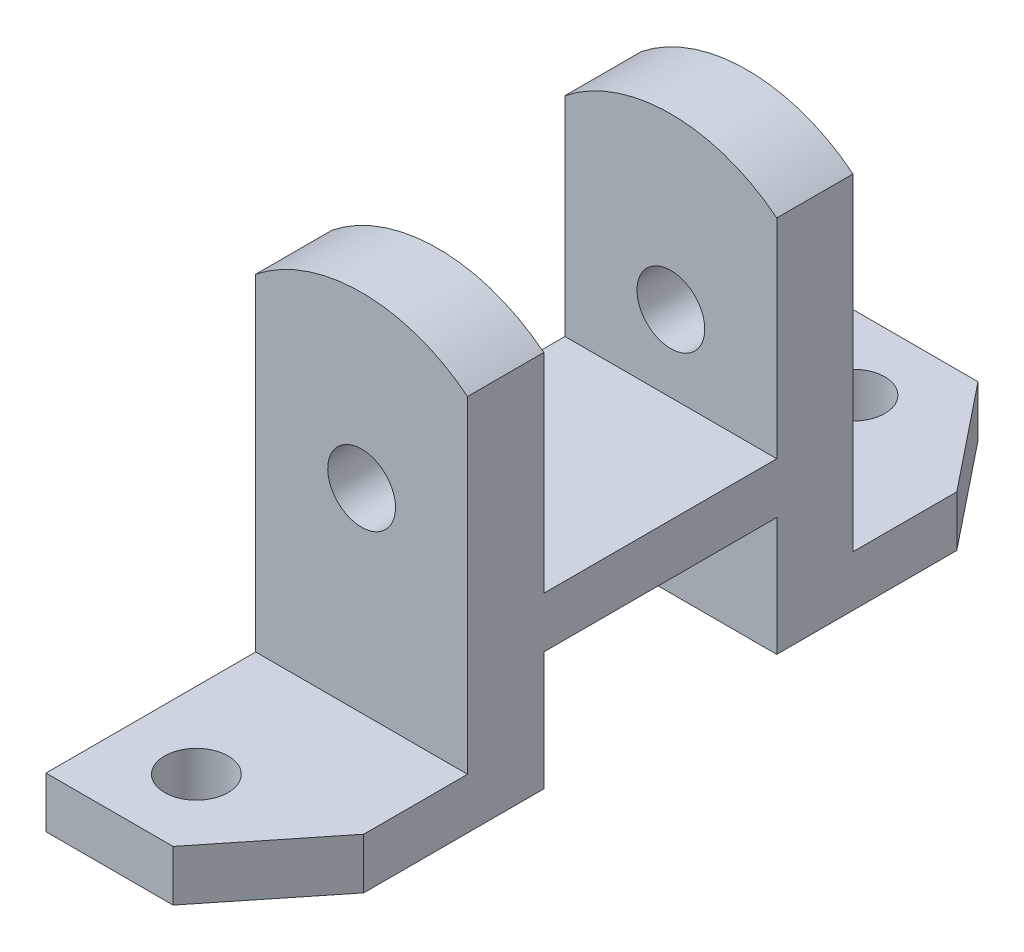
ISO-10303-21;
HEADER;
FILE_DESCRIPTION(('STEP AP214'),'2;1');
FILE_NAME('part.step','',(''),(''),'','','');
FILE_SCHEMA(('AUTOMOTIVE_DESIGN { 1 0 10303 214 1 1 1 1 }'));
ENDSEC;
DATA;
#1=APPLICATION_CONTEXT('core data for automotive mechanical design processes');
#2=APPLICATION_PROTOCOL_DEFINITION('international standard','automotive_design',2000,#1);
#3=PRODUCT_CONTEXT('',#1,'mechanical');
#4=PRODUCT('Part','Part','',(#3));
#5=PRODUCT_RELATED_PRODUCT_CATEGORY('part','',(#4));
#6=PRODUCT_DEFINITION_FORMATION('','',#4);
#7=PRODUCT_DEFINITION_CONTEXT('part definition',#1,'design');
#8=PRODUCT_DEFINITION('design','',#6,#7);
#9=PRODUCT_DEFINITION_SHAPE('','',#8);
#10=(LENGTH_UNIT() NAMED_UNIT(*) SI_UNIT(.MILLI.,.METRE.));
#11=(NAMED_UNIT(*) PLANE_ANGLE_UNIT() SI_UNIT($,.RADIAN.));
#12=(NAMED_UNIT(*) SI_UNIT($,.STERADIAN.) SOLID_ANGLE_UNIT());
#13=UNCERTAINTY_MEASURE_WITH_UNIT(LENGTH_MEASURE(1.E-05),#10,'distance_accuracy_value','');
#14=(GEOMETRIC_REPRESENTATION_CONTEXT(3) GLOBAL_UNCERTAINTY_ASSIGNED_CONTEXT((#13)) GLOBAL_UNIT_ASSIGNED_CONTEXT((#10,
#11,#12)) REPRESENTATION_CONTEXT('',''));
#15=CARTESIAN_POINT('',(0.,0.,0.));
#16=DIRECTION('',(0.,0.,1.));
#17=DIRECTION('',(1.,0.,0.));
#18=AXIS2_PLACEMENT_3D('',#15,#16,#17);
#19=CARTESIAN_POINT('',(25.,-40.,27.5));
#20=DIRECTION('',(0.,0.,1.));
#21=DIRECTION('',(1.,0.,0.));
#22=AXIS2_PLACEMENT_3D('',#19,#20,#21);
#23=PLANE('',#22);
#24=DIRECTION('',(-1.,0.,0.));
#25=VECTOR('',#24,1.);
#26=CARTESIAN_POINT('',(25.,-12.,27.5));
#27=LINE('',#26,#25);
#28=CARTESIAN_POINT('',(-11.,-12.,27.5));
#29=VERTEX_POINT('',#28);
#30=CARTESIAN_POINT('',(-25.,-12.,27.5));
#31=VERTEX_POINT('',#30);
#32=EDGE_CURVE('E249',#29,#31,#27,.T.);
#33=ORIENTED_EDGE('',*,*,#32,.F.);
#34=DIRECTION('',(0.,-1.,0.));
#35=VECTOR('',#34,1.);
#36=CARTESIAN_POINT('',(-11.,43.578772926361,27.5));
#37=LINE('',#36,#35);
#38=CARTESIAN_POINT('',(-11.,-40.,27.5));
#39=VERTEX_POINT('',#38);
#40=EDGE_CURVE('E233',#29,#39,#37,.T.);
#41=ORIENTED_EDGE('',*,*,#40,.T.);
#42=DIRECTION('',(-1.,0.,0.));
#43=VECTOR('',#42,1.);
#44=CARTESIAN_POINT('',(25.,-40.,27.5));
#45=LINE('',#44,#43);
#46=CARTESIAN_POINT('',(-25.,-40.,27.5));
#47=VERTEX_POINT('',#46);
#48=EDGE_CURVE('E265',#39,#47,#45,.T.);
#49=ORIENTED_EDGE('',*,*,#48,.T.);
#50=DIRECTION('',(0.,1.,0.));
#51=VECTOR('',#50,1.);
#52=CARTESIAN_POINT('',(-25.,-40.,27.5));
#53=LINE('',#52,#51);
#54=EDGE_CURVE('E256',#47,#31,#53,.T.);
#55=ORIENTED_EDGE('',*,*,#54,.T.);
#56=EDGE_LOOP('',(#33,#41,#49,#55));
#57=FACE_BOUND('',#56,.T.);
#58=ADVANCED_FACE('F83',(#57),#23,.F.);
#59=CARTESIAN_POINT('',(25.,-12.,27.5));
#60=DIRECTION('',(0.,1.,0.));
#61=DIRECTION('',(0.,0.,1.));
#62=AXIS2_PLACEMENT_3D('',#59,#60,#61);
#63=PLANE('',#62);
#64=DIRECTION('',(-1.,0.,0.));
#65=VECTOR('',#64,1.);
#66=CARTESIAN_POINT('',(25.,-12.,-27.5));
#67=LINE('',#66,#65);
#68=CARTESIAN_POINT('',(-11.,-12.,-27.5));
#69=VERTEX_POINT('',#68);
#70=CARTESIAN_POINT('',(-25.,-12.,-27.5));
#71=VERTEX_POINT('',#70);
#72=EDGE_CURVE('E251',#69,#71,#67,.T.);
#73=ORIENTED_EDGE('',*,*,#72,.F.);
#74=DIRECTION('',(0.,0.,-1.));
#75=VECTOR('',#74,1.);
#76=CARTESIAN_POINT('',(-11.,-12.,-27.5));
#77=LINE('',#76,#75);
#78=EDGE_CURVE('E236',#29,#69,#77,.T.);
#79=ORIENTED_EDGE('',*,*,#78,.F.);
#80=ORIENTED_EDGE('',*,*,#32,.T.);
#81=DIRECTION('',(0.,0.,-1.));
#82=VECTOR('',#81,1.);
#83=CARTESIAN_POINT('',(-25.,-12.,27.5));
#84=LINE('',#83,#82);
#85=EDGE_CURVE('E444',#31,#71,#84,.T.);
#86=ORIENTED_EDGE('',*,*,#85,.T.);
#87=EDGE_LOOP('',(#73,#79,#80,#86));
#88=FACE_BOUND('',#87,.T.);
#89=ADVANCED_FACE('F247',(#88),#63,.F.);
#90=CARTESIAN_POINT('',(25.,-12.,-27.5));
#91=DIRECTION('',(0.,0.,-1.));
#92=DIRECTION('',(0.,1.,0.));
#93=AXIS2_PLACEMENT_3D('',#90,#91,#92);
#94=PLANE('',#93);
#95=DIRECTION('',(-1.,0.,0.));
#96=VECTOR('',#95,1.);
#97=CARTESIAN_POINT('',(25.,-40.,-27.5));
#98=LINE('',#97,#96);
#99=CARTESIAN_POINT('',(-11.,-40.,-27.5));
#100=VERTEX_POINT('',#99);
#101=CARTESIAN_POINT('',(-25.,-40.,-27.5));
#102=VERTEX_POINT('',#101);
#103=EDGE_CURVE('E403',#100,#102,#98,.T.);
#104=ORIENTED_EDGE('',*,*,#103,.F.);
#105=DIRECTION('',(0.,-1.,0.));
#106=VECTOR('',#105,1.);
#107=CARTESIAN_POINT('',(-11.,43.578772926361,-27.5));
#108=LINE('',#107,#106);
#109=EDGE_CURVE('E253',#69,#100,#108,.T.);
#110=ORIENTED_EDGE('',*,*,#109,.F.);
#111=ORIENTED_EDGE('',*,*,#72,.T.);
#112=DIRECTION('',(0.,-1.,0.));
#113=VECTOR('',#112,1.);
#114=CARTESIAN_POINT('',(-25.,-12.,-27.5));
#115=LINE('',#114,#113);
#116=EDGE_CURVE('E368',#71,#102,#115,.T.);
#117=ORIENTED_EDGE('',*,*,#116,.T.);
#118=EDGE_LOOP('',(#104,#110,#111,#117));
#119=FACE_BOUND('',#118,.T.);
#120=ADVANCED_FACE('F465',(#119),#94,.F.);
#121=CARTESIAN_POINT('',(25.,-28.,-45.5));
#122=DIRECTION('',(0.,0.,1.));
#123=DIRECTION('',(1.,0.,0.));
#124=AXIS2_PLACEMENT_3D('',#121,#122,#123);
#125=PLANE('',#124);
#126=CARTESIAN_POINT('',(0.,18.,-45.5));
#127=DIRECTION('',(0.,0.,1.));
#128=DIRECTION('',(1.,0.,0.));
#129=AXIS2_PLACEMENT_3D('',#126,#127,#128);
#130=CIRCLE('',#129,8.);
#131=CARTESIAN_POINT('',(8.,18.,-45.5));
#132=VERTEX_POINT('',#131);
#133=EDGE_CURVE('E358',#132,#132,#130,.T.);
#134=ORIENTED_EDGE('',*,*,#133,.T.);
#135=EDGE_LOOP('',(#134));
#136=FACE_BOUND('',#135,.T.);
#137=DIRECTION('',(0.,1.,0.));
#138=VECTOR('',#137,1.);
#139=CARTESIAN_POINT('',(-25.,-28.,-45.5));
#140=LINE('',#139,#138);
#141=CARTESIAN_POINT('',(-25.,-28.,-45.5));
#142=VERTEX_POINT('',#141);
#143=CARTESIAN_POINT('',(-25.,49.224989991992,-45.5));
#144=VERTEX_POINT('',#143);
#145=EDGE_CURVE('E414',#142,#144,#140,.T.);
#146=ORIENTED_EDGE('',*,*,#145,.T.);
#147=CARTESIAN_POINT('',(0.,18.,-45.5));
#148=DIRECTION('',(0.,0.,1.));
#149=DIRECTION('',(1.,0.,0.));
#150=AXIS2_PLACEMENT_3D('',#147,#148,#149);
#151=CIRCLE('',#150,40.);
#152=CARTESIAN_POINT('',(25.,49.224989991992,-45.5));
#153=VERTEX_POINT('',#152);
#154=EDGE_CURVE('E335',#144,#153,#151,.F.);
#155=ORIENTED_EDGE('',*,*,#154,.T.);
#156=DIRECTION('',(0.,1.,0.));
#157=VECTOR('',#156,1.);
#158=CARTESIAN_POINT('',(25.,-28.,-45.5));
#159=LINE('',#158,#157);
#160=CARTESIAN_POINT('',(25.,-28.,-45.5));
#161=VERTEX_POINT('',#160);
#162=EDGE_CURVE('E371',#161,#153,#159,.T.);
#163=ORIENTED_EDGE('',*,*,#162,.F.);
#164=DIRECTION('',(-1.,0.,0.));
#165=VECTOR('',#164,1.);
#166=CARTESIAN_POINT('',(25.,-28.,-45.5));
#167=LINE('',#166,#165);
#168=EDGE_CURVE('E292',#161,#142,#167,.T.);
#169=ORIENTED_EDGE('',*,*,#168,.T.);
#170=EDGE_LOOP('',(#146,#155,#163,#169));
#171=FACE_BOUND('',#170,.T.);
#172=ADVANCED_FACE('F485',(#136,#171),#125,.F.);
#173=CARTESIAN_POINT('',(25.,58.,-27.5));
#174=DIRECTION('',(0.,0.,-1.));
#175=DIRECTION('',(0.,1.,0.));
#176=AXIS2_PLACEMENT_3D('',#173,#174,#175);
#177=PLANE('',#176);
#178=CARTESIAN_POINT('',(0.,18.,-27.5));
#179=DIRECTION('',(0.,0.,-1.));
#180=DIRECTION('',(0.,1.,0.));
#181=AXIS2_PLACEMENT_3D('',#178,#179,#180);
#182=CIRCLE('',#181,8.);
#183=CARTESIAN_POINT('',(0.,26.,-27.5));
#184=VERTEX_POINT('',#183);
#185=EDGE_CURVE('E341',#184,#184,#182,.T.);
#186=ORIENTED_EDGE('',*,*,#185,.T.);
#187=EDGE_LOOP('',(#186));
#188=FACE_BOUND('',#187,.T.);
#189=CARTESIAN_POINT('',(0.,18.,-27.5));
#190=DIRECTION('',(0.,0.,-1.));
#191=DIRECTION('',(0.,1.,0.));
#192=AXIS2_PLACEMENT_3D('',#189,#190,#191);
#193=CIRCLE('',#192,40.);
#194=CARTESIAN_POINT('',(25.,49.224989991992,-27.5));
#195=VERTEX_POINT('',#194);
#196=CARTESIAN_POINT('',(-25.,49.224989991992,-27.5));
#197=VERTEX_POINT('',#196);
#198=EDGE_CURVE('E344',#195,#197,#193,.F.);
#199=ORIENTED_EDGE('',*,*,#198,.T.);
#200=DIRECTION('',(0.,-1.,0.));
#201=VECTOR('',#200,1.);
#202=CARTESIAN_POINT('',(-25.,58.,-27.5));
#203=LINE('',#202,#201);
#204=CARTESIAN_POINT('',(-25.,0.,-27.5));
#205=VERTEX_POINT('',#204);
#206=EDGE_CURVE('E417',#197,#205,#203,.T.);
#207=ORIENTED_EDGE('',*,*,#206,.T.);
#208=DIRECTION('',(-1.,0.,0.));
#209=VECTOR('',#208,1.);
#210=CARTESIAN_POINT('',(25.,0.,-27.5));
#211=LINE('',#210,#209);
#212=CARTESIAN_POINT('',(25.,0.,-27.5));
#213=VERTEX_POINT('',#212);
#214=EDGE_CURVE('E288',#213,#205,#211,.T.);
#215=ORIENTED_EDGE('',*,*,#214,.F.);
#216=DIRECTION('',(0.,-1.,0.));
#217=VECTOR('',#216,1.);
#218=CARTESIAN_POINT('',(25.,58.,-27.5));
#219=LINE('',#218,#217);
#220=EDGE_CURVE('E374',#195,#213,#219,.T.);
#221=ORIENTED_EDGE('',*,*,#220,.F.);
#222=EDGE_LOOP('',(#199,#207,#215,#221));
#223=FACE_BOUND('',#222,.T.);
#224=ADVANCED_FACE('F491',(#188,#223),#177,.F.);
#225=CARTESIAN_POINT('',(25.,58.,27.5));
#226=DIRECTION('',(0.,0.,1.));
#227=DIRECTION('',(0.,-1.,0.));
#228=AXIS2_PLACEMENT_3D('',#225,#226,#227);
#229=PLANE('',#228);
#230=CARTESIAN_POINT('',(0.,18.,27.5));
#231=DIRECTION('',(0.,0.,1.));
#232=DIRECTION('',(0.,-1.,0.));
#233=AXIS2_PLACEMENT_3D('',#230,#231,#232);
#234=CIRCLE('',#233,8.);
#235=CARTESIAN_POINT('',(0.,10.,27.5));
#236=VERTEX_POINT('',#235);
#237=EDGE_CURVE('E334',#236,#236,#234,.T.);
#238=ORIENTED_EDGE('',*,*,#237,.T.);
#239=EDGE_LOOP('',(#238));
#240=FACE_BOUND('',#239,.T.);
#241=DIRECTION('',(0.,1.,0.));
#242=VECTOR('',#241,1.);
#243=CARTESIAN_POINT('',(-25.,58.,27.5));
#244=LINE('',#243,#242);
#245=CARTESIAN_POINT('',(-25.,0.,27.5));
#246=VERTEX_POINT('',#245);
#247=CARTESIAN_POINT('',(-25.,49.224989991992,27.5));
#248=VERTEX_POINT('',#247);
#249=EDGE_CURVE('E423',#246,#248,#244,.T.);
#250=ORIENTED_EDGE('',*,*,#249,.T.);
#251=CARTESIAN_POINT('',(0.,18.,27.5));
#252=DIRECTION('',(0.,0.,1.));
#253=DIRECTION('',(0.,-1.,0.));
#254=AXIS2_PLACEMENT_3D('',#251,#252,#253);
#255=CIRCLE('',#254,40.);
#256=CARTESIAN_POINT('',(25.,49.224989991992,27.5));
#257=VERTEX_POINT('',#256);
#258=EDGE_CURVE('E351',#248,#257,#255,.F.);
#259=ORIENTED_EDGE('',*,*,#258,.T.);
#260=DIRECTION('',(0.,1.,0.));
#261=VECTOR('',#260,1.);
#262=CARTESIAN_POINT('',(25.,58.,27.5));
#263=LINE('',#262,#261);
#264=CARTESIAN_POINT('',(25.,0.,27.5));
#265=VERTEX_POINT('',#264);
#266=EDGE_CURVE('E380',#265,#257,#263,.T.);
#267=ORIENTED_EDGE('',*,*,#266,.F.);
#268=DIRECTION('',(-1.,0.,0.));
#269=VECTOR('',#268,1.);
#270=CARTESIAN_POINT('',(25.,0.,27.5));
#271=LINE('',#270,#269);
#272=EDGE_CURVE('E284',#265,#246,#271,.T.);
#273=ORIENTED_EDGE('',*,*,#272,.T.);
#274=EDGE_LOOP('',(#250,#259,#267,#273));
#275=FACE_BOUND('',#274,.T.);
#276=ADVANCED_FACE('F503',(#240,#275),#229,.F.);
#277=CARTESIAN_POINT('',(25.,-28.,45.5));
#278=DIRECTION('',(0.,0.,-1.));
#279=DIRECTION('',(0.,1.,0.));
#280=AXIS2_PLACEMENT_3D('',#277,#278,#279);
#281=PLANE('',#280);
#282=CARTESIAN_POINT('',(0.,18.,45.5));
#283=DIRECTION('',(0.,0.,-1.));
#284=DIRECTION('',(0.,1.,0.));
#285=AXIS2_PLACEMENT_3D('',#282,#283,#284);
#286=CIRCLE('',#285,8.);
#287=CARTESIAN_POINT('',(0.,26.,45.5));
#288=VERTEX_POINT('',#287);
#289=EDGE_CURVE('E331',#288,#288,#286,.T.);
#290=ORIENTED_EDGE('',*,*,#289,.T.);
#291=EDGE_LOOP('',(#290));
#292=FACE_BOUND('',#291,.T.);
#293=CARTESIAN_POINT('',(0.,18.,45.5));
#294=DIRECTION('',(0.,0.,-1.));
#295=DIRECTION('',(0.,1.,0.));
#296=AXIS2_PLACEMENT_3D('',#293,#294,#295);
#297=CIRCLE('',#296,40.);
#298=CARTESIAN_POINT('',(25.,49.224989991992,45.5));
#299=VERTEX_POINT('',#298);
#300=CARTESIAN_POINT('',(-25.,49.224989991992,45.5));
#301=VERTEX_POINT('',#300);
#302=EDGE_CURVE('E108',#299,#301,#297,.F.);
#303=ORIENTED_EDGE('',*,*,#302,.T.);
#304=DIRECTION('',(0.,-1.,0.));
#305=VECTOR('',#304,1.);
#306=CARTESIAN_POINT('',(-25.,-28.,45.5));
#307=LINE('',#306,#305);
#308=CARTESIAN_POINT('',(-25.,-28.,45.5));
#309=VERTEX_POINT('',#308);
#310=EDGE_CURVE('E427',#301,#309,#307,.T.);
#311=ORIENTED_EDGE('',*,*,#310,.T.);
#312=DIRECTION('',(-1.,0.,0.));
#313=VECTOR('',#312,1.);
#314=CARTESIAN_POINT('',(25.,-28.,45.5));
#315=LINE('',#314,#313);
#316=CARTESIAN_POINT('',(25.,-28.,45.5));
#317=VERTEX_POINT('',#316);
#318=EDGE_CURVE('E280',#317,#309,#315,.T.);
#319=ORIENTED_EDGE('',*,*,#318,.F.);
#320=DIRECTION('',(0.,-1.,0.));
#321=VECTOR('',#320,1.);
#322=CARTESIAN_POINT('',(25.,-28.,45.5));
#323=LINE('',#322,#321);
#324=EDGE_CURVE('E384',#299,#317,#323,.T.);
#325=ORIENTED_EDGE('',*,*,#324,.F.);
#326=EDGE_LOOP('',(#303,#311,#319,#325));
#327=FACE_BOUND('',#326,.T.);
#328=ADVANCED_FACE('F563',(#292,#327),#281,.F.);
#329=CARTESIAN_POINT('',(25.,-40.,-95.));
#330=DIRECTION('',(0.,0.,1.));
#331=DIRECTION('',(1.,0.,0.));
#332=AXIS2_PLACEMENT_3D('',#329,#330,#331);
#333=PLANE('',#332);
#334=DIRECTION('',(-1.,0.,0.));
#335=VECTOR('',#334,1.);
#336=CARTESIAN_POINT('',(25.,-28.,-95.));
#337=LINE('',#336,#335);
#338=CARTESIAN_POINT('',(4.9999999999999,-28.,-95.));
#339=VERTEX_POINT('',#338);
#340=CARTESIAN_POINT('',(-25.,-28.,-95.));
#341=VERTEX_POINT('',#340);
#342=EDGE_CURVE('E296',#339,#341,#337,.T.);
#343=ORIENTED_EDGE('',*,*,#342,.F.);
#344=DIRECTION('',(0.,-1.,0.));
#345=VECTOR('',#344,1.);
#346=CARTESIAN_POINT('',(4.9999999999999,-40.,-95.));
#347=LINE('',#346,#345);
#348=CARTESIAN_POINT('',(4.9999999999999,-40.,-95.));
#349=VERTEX_POINT('',#348);
#350=EDGE_CURVE('E322',#339,#349,#347,.T.);
#351=ORIENTED_EDGE('',*,*,#350,.T.);
#352=DIRECTION('',(-1.,0.,0.));
#353=VECTOR('',#352,1.);
#354=CARTESIAN_POINT('',(25.,-40.,-95.));
#355=LINE('',#354,#353);
#356=CARTESIAN_POINT('',(-25.,-40.,-95.));
#357=VERTEX_POINT('',#356);
#358=EDGE_CURVE('E299',#349,#357,#355,.T.);
#359=ORIENTED_EDGE('',*,*,#358,.T.);
#360=DIRECTION('',(0.,1.,0.));
#361=VECTOR('',#360,1.);
#362=CARTESIAN_POINT('',(-25.,-40.,-95.));
#363=LINE('',#362,#361);
#364=EDGE_CURVE('E407',#357,#341,#363,.T.);
#365=ORIENTED_EDGE('',*,*,#364,.T.);
#366=EDGE_LOOP('',(#343,#351,#359,#365));
#367=FACE_BOUND('',#366,.T.);
#368=ADVANCED_FACE('F474',(#367),#333,.F.);
#369=CARTESIAN_POINT('',(25.,-28.,-95.));
#370=DIRECTION('',(0.,-1.,0.));
#371=DIRECTION('',(0.,0.,-1.));
#372=AXIS2_PLACEMENT_3D('',#369,#370,#371);
#373=PLANE('',#372);
#374=CARTESIAN_POINT('',(-7.,-28.,-77.5));
#375=DIRECTION('',(0.,1.,0.));
#376=DIRECTION('',(0.,0.,1.));
#377=AXIS2_PLACEMENT_3D('',#374,#375,#376);
#378=CIRCLE('',#377,7.5);
#379=CARTESIAN_POINT('',(-7.,-28.,-70.));
#380=VERTEX_POINT('',#379);
#381=EDGE_CURVE('E514',#380,#380,#378,.T.);
#382=ORIENTED_EDGE('',*,*,#381,.F.);
#383=EDGE_LOOP('',(#382));
#384=FACE_BOUND('',#383,.T.);
#385=DIRECTION('',(0.,0.,1.));
#386=VECTOR('',#385,1.);
#387=CARTESIAN_POINT('',(25.,-28.,-95.));
#388=LINE('',#387,#386);
#389=CARTESIAN_POINT('',(25.,-28.,-69.9999999999999));
#390=VERTEX_POINT('',#389);
#391=EDGE_CURVE('E367',#390,#161,#388,.T.);
#392=ORIENTED_EDGE('',*,*,#391,.F.);
#393=DIRECTION('',(-0.624695047554424,0.,-0.780868809443031));
#394=VECTOR('',#393,1.);
#395=CARTESIAN_POINT('',(25.,-28.,-69.9999999999999));
#396=LINE('',#395,#394);
#397=EDGE_CURVE('E319',#390,#339,#396,.T.);
#398=ORIENTED_EDGE('',*,*,#397,.T.);
#399=ORIENTED_EDGE('',*,*,#342,.T.);
#400=DIRECTION('',(0.,0.,1.));
#401=VECTOR('',#400,1.);
#402=CARTESIAN_POINT('',(-25.,-28.,-95.));
#403=LINE('',#402,#401);
#404=EDGE_CURVE('E411',#341,#142,#403,.T.);
#405=ORIENTED_EDGE('',*,*,#404,.T.);
#406=ORIENTED_EDGE('',*,*,#168,.F.);
#407=EDGE_LOOP('',(#392,#398,#399,#405,#406));
#408=FACE_BOUND('',#407,.T.);
#409=ADVANCED_FACE('F484',(#384,#408),#373,.F.);
#410=CARTESIAN_POINT('',(25.,0.,27.5));
#411=DIRECTION('',(0.,-1.,0.));
#412=DIRECTION('',(0.,0.,-1.));
#413=AXIS2_PLACEMENT_3D('',#410,#411,#412);
#414=PLANE('',#413);
#415=DIRECTION('',(0.,0.,1.));
#416=VECTOR('',#415,1.);
#417=CARTESIAN_POINT('',(-25.,0.,27.5));
#418=LINE('',#417,#416);
#419=EDGE_CURVE('E420',#205,#246,#418,.T.);
#420=ORIENTED_EDGE('',*,*,#419,.T.);
#421=ORIENTED_EDGE('',*,*,#272,.F.);
#422=DIRECTION('',(0.,0.,1.));
#423=VECTOR('',#422,1.);
#424=CARTESIAN_POINT('',(25.,0.,27.5));
#425=LINE('',#424,#423);
#426=EDGE_CURVE('E377',#213,#265,#425,.T.);
#427=ORIENTED_EDGE('',*,*,#426,.F.);
#428=ORIENTED_EDGE('',*,*,#214,.T.);
#429=EDGE_LOOP('',(#420,#421,#427,#428));
#430=FACE_BOUND('',#429,.T.);
#431=ADVANCED_FACE('F498',(#430),#414,.F.);
#432=CARTESIAN_POINT('',(25.,-28.,95.));
#433=DIRECTION('',(0.,-1.,0.));
#434=DIRECTION('',(0.,0.,-1.));
#435=AXIS2_PLACEMENT_3D('',#432,#433,#434);
#436=PLANE('',#435);
#437=CARTESIAN_POINT('',(-7.,-28.,77.5));
#438=DIRECTION('',(0.,1.,0.));
#439=DIRECTION('',(0.,0.,1.));
#440=AXIS2_PLACEMENT_3D('',#437,#438,#439);
#441=CIRCLE('',#440,7.5);
#442=CARTESIAN_POINT('',(-7.,-28.,85.));
#443=VERTEX_POINT('',#442);
#444=EDGE_CURVE('E519',#443,#443,#441,.T.);
#445=ORIENTED_EDGE('',*,*,#444,.F.);
#446=EDGE_LOOP('',(#445));
#447=FACE_BOUND('',#446,.T.);
#448=DIRECTION('',(-1.,0.,0.));
#449=VECTOR('',#448,1.);
#450=CARTESIAN_POINT('',(25.,-28.,95.));
#451=LINE('',#450,#449);
#452=CARTESIAN_POINT('',(4.99999999999996,-28.,95.));
#453=VERTEX_POINT('',#452);
#454=CARTESIAN_POINT('',(-25.,-28.,95.));
#455=VERTEX_POINT('',#454);
#456=EDGE_CURVE('E277',#453,#455,#451,.T.);
#457=ORIENTED_EDGE('',*,*,#456,.F.);
#458=DIRECTION('',(0.624695047554424,0.,-0.780868809443031));
#459=VECTOR('',#458,1.);
#460=CARTESIAN_POINT('',(25.,-28.,69.9999999999999));
#461=LINE('',#460,#459);
#462=CARTESIAN_POINT('',(25.,-28.,69.9999999999999));
#463=VERTEX_POINT('',#462);
#464=EDGE_CURVE('E316',#453,#463,#461,.T.);
#465=ORIENTED_EDGE('',*,*,#464,.T.);
#466=DIRECTION('',(0.,0.,1.));
#467=VECTOR('',#466,1.);
#468=CARTESIAN_POINT('',(25.,-28.,95.));
#469=LINE('',#468,#467);
#470=EDGE_CURVE('E387',#317,#463,#469,.T.);
#471=ORIENTED_EDGE('',*,*,#470,.F.);
#472=ORIENTED_EDGE('',*,*,#318,.T.);
#473=DIRECTION('',(0.,0.,1.));
#474=VECTOR('',#473,1.);
#475=CARTESIAN_POINT('',(-25.,-28.,95.));
#476=LINE('',#475,#474);
#477=EDGE_CURVE('E430',#309,#455,#476,.T.);
#478=ORIENTED_EDGE('',*,*,#477,.T.);
#479=EDGE_LOOP('',(#457,#465,#471,#472,#478));
#480=FACE_BOUND('',#479,.T.);
#481=ADVANCED_FACE('F560',(#447,#480),#436,.F.);
#482=CARTESIAN_POINT('',(25.,-40.,95.));
#483=DIRECTION('',(0.,0.,-1.));
#484=DIRECTION('',(-1.,0.,0.));
#485=AXIS2_PLACEMENT_3D('',#482,#483,#484);
#486=PLANE('',#485);
#487=DIRECTION('',(-1.,0.,0.));
#488=VECTOR('',#487,1.);
#489=CARTESIAN_POINT('',(25.,-40.,95.));
#490=LINE('',#489,#488);
#491=CARTESIAN_POINT('',(4.99999999999996,-40.,95.));
#492=VERTEX_POINT('',#491);
#493=CARTESIAN_POINT('',(-25.,-40.,95.));
#494=VERTEX_POINT('',#493);
#495=EDGE_CURVE('E274',#492,#494,#490,.T.);
#496=ORIENTED_EDGE('',*,*,#495,.F.);
#497=DIRECTION('',(0.,1.,0.));
#498=VECTOR('',#497,1.);
#499=CARTESIAN_POINT('',(4.99999999999996,-28.,95.));
#500=LINE('',#499,#498);
#501=EDGE_CURVE('E313',#492,#453,#500,.T.);
#502=ORIENTED_EDGE('',*,*,#501,.T.);
#503=ORIENTED_EDGE('',*,*,#456,.T.);
#504=DIRECTION('',(0.,-1.,0.));
#505=VECTOR('',#504,1.);
#506=CARTESIAN_POINT('',(-25.,-40.,95.));
#507=LINE('',#506,#505);
#508=EDGE_CURVE('E434',#455,#494,#507,.T.);
#509=ORIENTED_EDGE('',*,*,#508,.T.);
#510=EDGE_LOOP('',(#496,#502,#503,#509));
#511=FACE_BOUND('',#510,.T.);
#512=ADVANCED_FACE('F552',(#511),#486,.F.);
#513=CARTESIAN_POINT('',(25.,-40.,95.));
#514=DIRECTION('',(0.,1.,0.));
#515=DIRECTION('',(0.,0.,1.));
#516=AXIS2_PLACEMENT_3D('',#513,#514,#515);
#517=PLANE('',#516);
#518=CARTESIAN_POINT('',(-7.,-40.,77.5));
#519=DIRECTION('',(0.,1.,0.));
#520=DIRECTION('',(0.,0.,1.));
#521=AXIS2_PLACEMENT_3D('',#518,#519,#520);
#522=CIRCLE('',#521,7.5);
#523=CARTESIAN_POINT('',(-7.,-40.,85.));
#524=VERTEX_POINT('',#523);
#525=EDGE_CURVE('E507',#524,#524,#522,.T.);
#526=ORIENTED_EDGE('',*,*,#525,.T.);
#527=EDGE_LOOP('',(#526));
#528=FACE_BOUND('',#527,.T.);
#529=DIRECTION('',(0.,0.,-1.));
#530=VECTOR('',#529,1.);
#531=CARTESIAN_POINT('',(25.,-40.,95.));
#532=LINE('',#531,#530);
#533=CARTESIAN_POINT('',(25.,-40.,69.9999999999999));
#534=VERTEX_POINT('',#533);
#535=CARTESIAN_POINT('',(25.,-40.,27.5));
#536=VERTEX_POINT('',#535);
#537=EDGE_CURVE('E391',#534,#536,#532,.T.);
#538=ORIENTED_EDGE('',*,*,#537,.F.);
#539=DIRECTION('',(-0.624695047554424,0.,0.780868809443031));
#540=VECTOR('',#539,1.);
#541=CARTESIAN_POINT('',(25.,-40.,69.9999999999999));
#542=LINE('',#541,#540);
#543=EDGE_CURVE('E310',#534,#492,#542,.T.);
#544=ORIENTED_EDGE('',*,*,#543,.T.);
#545=ORIENTED_EDGE('',*,*,#495,.T.);
#546=DIRECTION('',(0.,0.,-1.));
#547=VECTOR('',#546,1.);
#548=CARTESIAN_POINT('',(-25.,-40.,95.));
#549=LINE('',#548,#547);
#550=EDGE_CURVE('E438',#494,#47,#549,.T.);
#551=ORIENTED_EDGE('',*,*,#550,.T.);
#552=ORIENTED_EDGE('',*,*,#48,.F.);
#553=DIRECTION('',(0.,0.,-1.));
#554=VECTOR('',#553,1.);
#555=CARTESIAN_POINT('',(-11.,-40.,-27.5));
#556=LINE('',#555,#554);
#557=EDGE_CURVE('E239',#39,#100,#556,.T.);
#558=ORIENTED_EDGE('',*,*,#557,.T.);
#559=ORIENTED_EDGE('',*,*,#103,.T.);
#560=DIRECTION('',(0.,0.,-1.));
#561=VECTOR('',#560,1.);
#562=CARTESIAN_POINT('',(-25.,-40.,-27.5));
#563=LINE('',#562,#561);
#564=EDGE_CURVE('E362',#102,#357,#563,.T.);
#565=ORIENTED_EDGE('',*,*,#564,.T.);
#566=ORIENTED_EDGE('',*,*,#358,.F.);
#567=DIRECTION('',(0.624695047554424,0.,0.780868809443031));
#568=VECTOR('',#567,1.);
#569=CARTESIAN_POINT('',(25.,-40.,-69.9999999999999));
#570=LINE('',#569,#568);
#571=CARTESIAN_POINT('',(25.,-40.,-69.9999999999999));
#572=VERTEX_POINT('',#571);
#573=EDGE_CURVE('E325',#349,#572,#570,.T.);
#574=ORIENTED_EDGE('',*,*,#573,.T.);
#575=DIRECTION('',(0.,0.,-1.));
#576=VECTOR('',#575,1.);
#577=CARTESIAN_POINT('',(25.,-40.,-27.5));
#578=LINE('',#577,#576);
#579=CARTESIAN_POINT('',(25.,-40.,-27.5));
#580=VERTEX_POINT('',#579);
#581=EDGE_CURVE('E363',#580,#572,#578,.T.);
#582=ORIENTED_EDGE('',*,*,#581,.F.);
#583=CARTESIAN_POINT('',(-3.00000000000001,-40.,-27.5));
#584=VERTEX_POINT('',#583);
#585=EDGE_CURVE('E449',#580,#584,#98,.T.);
#586=ORIENTED_EDGE('',*,*,#585,.T.);
#587=DIRECTION('',(0.,0.,1.));
#588=VECTOR('',#587,1.);
#589=CARTESIAN_POINT('',(-3.00000000000001,-40.,-27.5));
#590=LINE('',#589,#588);
#591=CARTESIAN_POINT('',(-3.00000000000001,-40.,27.5));
#592=VERTEX_POINT('',#591);
#593=EDGE_CURVE('E100',#584,#592,#590,.T.);
#594=ORIENTED_EDGE('',*,*,#593,.T.);
#595=EDGE_CURVE('E270',#536,#592,#45,.T.);
#596=ORIENTED_EDGE('',*,*,#595,.F.);
#597=EDGE_LOOP('',(#538,#544,#545,#551,#552,#558,#559,#565,#566,#574,#582,#586,#594,#596));
#598=FACE_BOUND('',#597,.T.);
#599=CARTESIAN_POINT('',(-7.,-40.,-77.5));
#600=DIRECTION('',(0.,1.,0.));
#601=DIRECTION('',(0.,0.,1.));
#602=AXIS2_PLACEMENT_3D('',#599,#600,#601);
#603=CIRCLE('',#602,7.5);
#604=CARTESIAN_POINT('',(-7.,-40.,-70.));
#605=VERTEX_POINT('',#604);
#606=EDGE_CURVE('E510',#605,#605,#603,.T.);
#607=ORIENTED_EDGE('',*,*,#606,.T.);
#608=EDGE_LOOP('',(#607));
#609=FACE_BOUND('',#608,.T.);
#610=ADVANCED_FACE('F459',(#528,#598,#609),#517,.F.);
#611=ORIENTED_EDGE('',*,*,#595,.T.);
#612=DIRECTION('',(0.,-1.,0.));
#613=VECTOR('',#612,1.);
#614=CARTESIAN_POINT('',(-3.00000000000001,43.578772926361,27.5));
#615=LINE('',#614,#613);
#616=CARTESIAN_POINT('',(-3.00000000000001,-12.,27.5));
#617=VERTEX_POINT('',#616);
#618=EDGE_CURVE('E515',#617,#592,#615,.T.);
#619=ORIENTED_EDGE('',*,*,#618,.F.);
#620=CARTESIAN_POINT('',(25.,-12.,27.5));
#621=VERTEX_POINT('',#620);
#622=EDGE_CURVE('E259',#621,#617,#27,.T.);
#623=ORIENTED_EDGE('',*,*,#622,.F.);
#624=DIRECTION('',(0.,1.,0.));
#625=VECTOR('',#624,1.);
#626=CARTESIAN_POINT('',(25.,-40.,27.5));
#627=LINE('',#626,#625);
#628=EDGE_CURVE('E394',#536,#621,#627,.T.);
#629=ORIENTED_EDGE('',*,*,#628,.F.);
#630=EDGE_LOOP('',(#611,#619,#623,#629));
#631=FACE_BOUND('',#630,.T.);
#632=ADVANCED_FACE('F543',(#631),#23,.F.);
#633=ORIENTED_EDGE('',*,*,#622,.T.);
#634=DIRECTION('',(0.,0.,1.));
#635=VECTOR('',#634,1.);
#636=CARTESIAN_POINT('',(-3.00000000000001,-12.,-27.5));
#637=LINE('',#636,#635);
#638=CARTESIAN_POINT('',(-3.00000000000001,-12.,-27.5));
#639=VERTEX_POINT('',#638);
#640=EDGE_CURVE('E527',#639,#617,#637,.T.);
#641=ORIENTED_EDGE('',*,*,#640,.F.);
#642=CARTESIAN_POINT('',(25.,-12.,-27.5));
#643=VERTEX_POINT('',#642);
#644=EDGE_CURVE('E260',#643,#639,#67,.T.);
#645=ORIENTED_EDGE('',*,*,#644,.F.);
#646=DIRECTION('',(0.,0.,-1.));
#647=VECTOR('',#646,1.);
#648=CARTESIAN_POINT('',(25.,-12.,27.5));
#649=LINE('',#648,#647);
#650=EDGE_CURVE('E397',#621,#643,#649,.T.);
#651=ORIENTED_EDGE('',*,*,#650,.F.);
#652=EDGE_LOOP('',(#633,#641,#645,#651));
#653=FACE_BOUND('',#652,.T.);
#654=ADVANCED_FACE('F588',(#653),#63,.F.);
#655=ORIENTED_EDGE('',*,*,#644,.T.);
#656=DIRECTION('',(0.,-1.,0.));
#657=VECTOR('',#656,1.);
#658=CARTESIAN_POINT('',(-3.00000000000001,43.578772926361,-27.5));
#659=LINE('',#658,#657);
#660=EDGE_CURVE('E531',#639,#584,#659,.T.);
#661=ORIENTED_EDGE('',*,*,#660,.T.);
#662=ORIENTED_EDGE('',*,*,#585,.F.);
#663=DIRECTION('',(0.,-1.,0.));
#664=VECTOR('',#663,1.);
#665=CARTESIAN_POINT('',(25.,-12.,-27.5));
#666=LINE('',#665,#664);
#667=EDGE_CURVE('E400',#643,#580,#666,.T.);
#668=ORIENTED_EDGE('',*,*,#667,.F.);
#669=EDGE_LOOP('',(#655,#661,#662,#668));
#670=FACE_BOUND('',#669,.T.);
#671=ADVANCED_FACE('F595',(#670),#94,.F.);
#672=CARTESIAN_POINT('',(25.,0.,0.));
#673=DIRECTION('',(1.,0.,0.));
#674=DIRECTION('',(0.,0.,-1.));
#675=AXIS2_PLACEMENT_3D('',#672,#673,#674);
#676=PLANE('',#675);
#677=DIRECTION('',(0.,0.,-1.));
#678=VECTOR('',#677,1.);
#679=CARTESIAN_POINT('',(25.,49.224989991992,95.));
#680=LINE('',#679,#678);
#681=EDGE_CURVE('E330',#299,#257,#680,.T.);
#682=ORIENTED_EDGE('',*,*,#681,.F.);
#683=ORIENTED_EDGE('',*,*,#324,.T.);
#684=ORIENTED_EDGE('',*,*,#470,.T.);
#685=DIRECTION('',(0.,-1.,0.));
#686=VECTOR('',#685,1.);
#687=CARTESIAN_POINT('',(25.,-40.,69.9999999999999));
#688=LINE('',#687,#686);
#689=EDGE_CURVE('E306',#463,#534,#688,.T.);
#690=ORIENTED_EDGE('',*,*,#689,.T.);
#691=ORIENTED_EDGE('',*,*,#537,.T.);
#692=ORIENTED_EDGE('',*,*,#628,.T.);
#693=ORIENTED_EDGE('',*,*,#650,.T.);
#694=ORIENTED_EDGE('',*,*,#667,.T.);
#695=ORIENTED_EDGE('',*,*,#581,.T.);
#696=DIRECTION('',(0.,1.,0.));
#697=VECTOR('',#696,1.);
#698=CARTESIAN_POINT('',(25.,-28.,-69.9999999999999));
#699=LINE('',#698,#697);
#700=EDGE_CURVE('E302',#572,#390,#699,.T.);
#701=ORIENTED_EDGE('',*,*,#700,.T.);
#702=ORIENTED_EDGE('',*,*,#391,.T.);
#703=ORIENTED_EDGE('',*,*,#162,.T.);
#704=EDGE_CURVE('E328',#195,#153,#680,.T.);
#705=ORIENTED_EDGE('',*,*,#704,.F.);
#706=ORIENTED_EDGE('',*,*,#220,.T.);
#707=ORIENTED_EDGE('',*,*,#426,.T.);
#708=ORIENTED_EDGE('',*,*,#266,.T.);
#709=EDGE_LOOP('',(#682,#683,#684,#690,#691,#692,#693,#694,#695,#701,#702,#703,#705,#706,#707,#708));
#710=FACE_BOUND('',#709,.T.);
#711=ADVANCED_FACE('F481',(#710),#676,.T.);
#712=CARTESIAN_POINT('',(-25.,0.,0.));
#713=DIRECTION('',(1.,0.,0.));
#714=DIRECTION('',(0.,0.,-1.));
#715=AXIS2_PLACEMENT_3D('',#712,#713,#714);
#716=PLANE('',#715);
#717=ORIENTED_EDGE('',*,*,#310,.F.);
#718=DIRECTION('',(0.,0.,-1.));
#719=VECTOR('',#718,1.);
#720=CARTESIAN_POINT('',(-25.,49.224989991992,95.));
#721=LINE('',#720,#719);
#722=EDGE_CURVE('E12',#301,#248,#721,.T.);
#723=ORIENTED_EDGE('',*,*,#722,.T.);
#724=ORIENTED_EDGE('',*,*,#249,.F.);
#725=ORIENTED_EDGE('',*,*,#419,.F.);
#726=ORIENTED_EDGE('',*,*,#206,.F.);
#727=EDGE_CURVE('E88',#197,#144,#721,.T.);
#728=ORIENTED_EDGE('',*,*,#727,.T.);
#729=ORIENTED_EDGE('',*,*,#145,.F.);
#730=ORIENTED_EDGE('',*,*,#404,.F.);
#731=ORIENTED_EDGE('',*,*,#364,.F.);
#732=ORIENTED_EDGE('',*,*,#564,.F.);
#733=ORIENTED_EDGE('',*,*,#116,.F.);
#734=ORIENTED_EDGE('',*,*,#85,.F.);
#735=ORIENTED_EDGE('',*,*,#54,.F.);
#736=ORIENTED_EDGE('',*,*,#550,.F.);
#737=ORIENTED_EDGE('',*,*,#508,.F.);
#738=ORIENTED_EDGE('',*,*,#477,.F.);
#739=EDGE_LOOP('',(#717,#723,#724,#725,#726,#728,#729,#730,#731,#732,#733,#734,#735,#736,#737,#738));
#740=FACE_BOUND('',#739,.T.);
#741=ADVANCED_FACE('F469',(#740),#716,.F.);
#742=CARTESIAN_POINT('',(25.,0.,69.9999999999999));
#743=DIRECTION('',(0.780868809443031,0.,0.624695047554424));
#744=DIRECTION('',(0.,1.,0.));
#745=AXIS2_PLACEMENT_3D('',#742,#743,#744);
#746=PLANE('',#745);
#747=ORIENTED_EDGE('',*,*,#464,.F.);
#748=ORIENTED_EDGE('',*,*,#501,.F.);
#749=ORIENTED_EDGE('',*,*,#543,.F.);
#750=ORIENTED_EDGE('',*,*,#689,.F.);
#751=EDGE_LOOP('',(#747,#748,#749,#750));
#752=FACE_BOUND('',#751,.T.);
#753=ADVANCED_FACE('F557',(#752),#746,.T.);
#754=CARTESIAN_POINT('',(25.,0.,-69.9999999999999));
#755=DIRECTION('',(0.780868809443031,0.,-0.624695047554424));
#756=DIRECTION('',(0.,-1.,0.));
#757=AXIS2_PLACEMENT_3D('',#754,#755,#756);
#758=PLANE('',#757);
#759=ORIENTED_EDGE('',*,*,#573,.F.);
#760=ORIENTED_EDGE('',*,*,#350,.F.);
#761=ORIENTED_EDGE('',*,*,#397,.F.);
#762=ORIENTED_EDGE('',*,*,#700,.F.);
#763=EDGE_LOOP('',(#759,#760,#761,#762));
#764=FACE_BOUND('',#763,.T.);
#765=ADVANCED_FACE('F86',(#764),#758,.T.);
#766=CARTESIAN_POINT('',(0.,18.,95.));
#767=DIRECTION('',(0.,0.,-1.));
#768=DIRECTION('',(-1.,0.,0.));
#769=AXIS2_PLACEMENT_3D('',#766,#767,#768);
#770=CYLINDRICAL_SURFACE('',#769,40.);
#771=ORIENTED_EDGE('',*,*,#154,.F.);
#772=ORIENTED_EDGE('',*,*,#727,.F.);
#773=ORIENTED_EDGE('',*,*,#198,.F.);
#774=ORIENTED_EDGE('',*,*,#704,.T.);
#775=EDGE_LOOP('',(#771,#772,#773,#774));
#776=FACE_BOUND('',#775,.T.);
#777=ADVANCED_FACE('F569',(#776),#770,.T.);
#778=ORIENTED_EDGE('',*,*,#258,.F.);
#779=ORIENTED_EDGE('',*,*,#722,.F.);
#780=ORIENTED_EDGE('',*,*,#302,.F.);
#781=ORIENTED_EDGE('',*,*,#681,.T.);
#782=EDGE_LOOP('',(#778,#779,#780,#781));
#783=FACE_BOUND('',#782,.T.);
#784=ADVANCED_FACE('F571',(#783),#770,.T.);
#785=CARTESIAN_POINT('',(0.,18.,95.));
#786=DIRECTION('',(0.,0.,-1.));
#787=DIRECTION('',(-1.,0.,0.));
#788=AXIS2_PLACEMENT_3D('',#785,#786,#787);
#789=CYLINDRICAL_SURFACE('',#788,8.);
#790=ORIENTED_EDGE('',*,*,#289,.F.);
#791=EDGE_LOOP('',(#790));
#792=FACE_BOUND('',#791,.T.);
#793=ORIENTED_EDGE('',*,*,#237,.F.);
#794=EDGE_LOOP('',(#793));
#795=FACE_BOUND('',#794,.T.);
#796=ADVANCED_FACE('F577',(#792,#795),#789,.F.);
#797=ORIENTED_EDGE('',*,*,#185,.F.);
#798=EDGE_LOOP('',(#797));
#799=FACE_BOUND('',#798,.T.);
#800=ORIENTED_EDGE('',*,*,#133,.F.);
#801=EDGE_LOOP('',(#800));
#802=FACE_BOUND('',#801,.T.);
#803=ADVANCED_FACE('F677',(#799,#802),#789,.F.);
#804=CARTESIAN_POINT('',(-7.,-40.,77.5));
#805=DIRECTION('',(0.,1.,0.));
#806=DIRECTION('',(0.,0.,1.));
#807=AXIS2_PLACEMENT_3D('',#804,#805,#806);
#808=CYLINDRICAL_SURFACE('',#807,7.5);
#809=ORIENTED_EDGE('',*,*,#525,.F.);
#810=EDGE_LOOP('',(#809));
#811=FACE_BOUND('',#810,.T.);
#812=ORIENTED_EDGE('',*,*,#444,.T.);
#813=EDGE_LOOP('',(#812));
#814=FACE_BOUND('',#813,.T.);
#815=ADVANCED_FACE('F674',(#811,#814),#808,.F.);
#816=CARTESIAN_POINT('',(-7.,-40.,-77.5));
#817=DIRECTION('',(0.,1.,0.));
#818=DIRECTION('',(0.,0.,1.));
#819=AXIS2_PLACEMENT_3D('',#816,#817,#818);
#820=CYLINDRICAL_SURFACE('',#819,7.5);
#821=ORIENTED_EDGE('',*,*,#606,.F.);
#822=EDGE_LOOP('',(#821));
#823=FACE_BOUND('',#822,.T.);
#824=ORIENTED_EDGE('',*,*,#381,.T.);
#825=EDGE_LOOP('',(#824));
#826=FACE_BOUND('',#825,.T.);
#827=ADVANCED_FACE('F661',(#823,#826),#820,.F.);
#828=CARTESIAN_POINT('',(-11.,43.578772926361,-27.5));
#829=DIRECTION('',(-1.,0.,0.));
#830=DIRECTION('',(0.,0.,1.));
#831=AXIS2_PLACEMENT_3D('',#828,#829,#830);
#832=PLANE('',#831);
#833=ORIENTED_EDGE('',*,*,#40,.F.);
#834=ORIENTED_EDGE('',*,*,#78,.T.);
#835=ORIENTED_EDGE('',*,*,#109,.T.);
#836=ORIENTED_EDGE('',*,*,#557,.F.);
#837=EDGE_LOOP('',(#833,#834,#835,#836));
#838=FACE_BOUND('',#837,.T.);
#839=ADVANCED_FACE('F235',(#838),#832,.T.);
#840=CARTESIAN_POINT('',(-3.00000000000001,43.578772926361,-27.5));
#841=DIRECTION('',(1.,0.,0.));
#842=DIRECTION('',(0.,0.,-1.));
#843=AXIS2_PLACEMENT_3D('',#840,#841,#842);
#844=PLANE('',#843);
#845=ORIENTED_EDGE('',*,*,#660,.F.);
#846=ORIENTED_EDGE('',*,*,#640,.T.);
#847=ORIENTED_EDGE('',*,*,#618,.T.);
#848=ORIENTED_EDGE('',*,*,#593,.F.);
#849=EDGE_LOOP('',(#845,#846,#847,#848));
#850=FACE_BOUND('',#849,.T.);
#851=ADVANCED_FACE('F660',(#850),#844,.T.);
#852=CLOSED_SHELL('',(#58,#89,#120,#172,#224,#276,#328,#368,#409,#431,#481,#512,#610,#632,#654,
#671,#711,#741,#753,#765,#777,#784,#796,#803,#815,#827,#839,#851));
#853=MANIFOLD_SOLID_BREP('B2',#852);
#854=ADVANCED_BREP_SHAPE_REPRESENTATION('',(#18,#853),#14);
#855=SHAPE_DEFINITION_REPRESENTATION(#9,#854);
ENDSEC;
END-ISO-10303-21;
